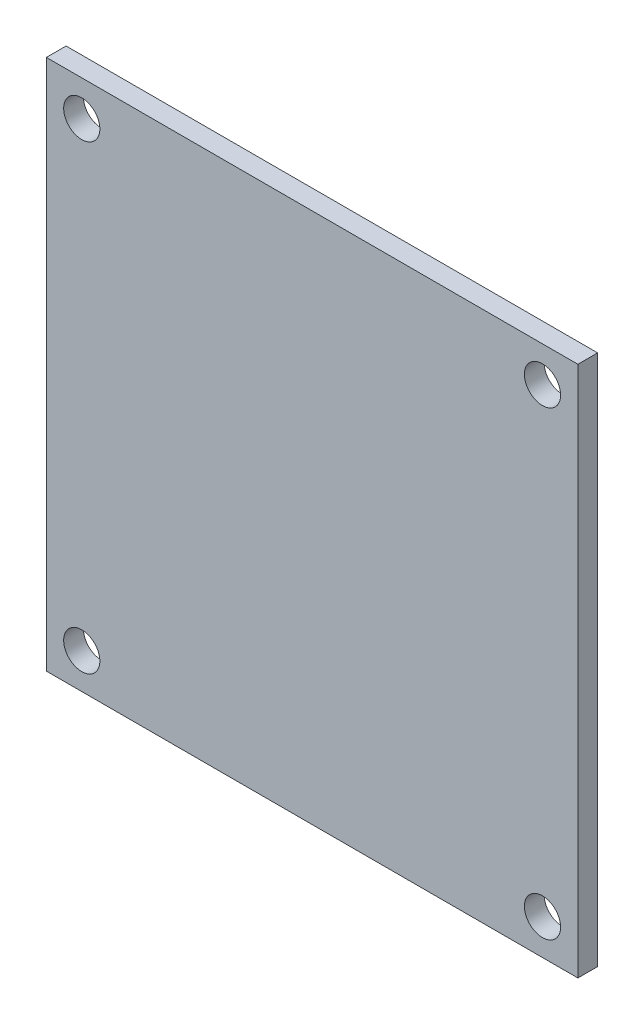
ISO-10303-21;
HEADER;
FILE_DESCRIPTION(('STEP AP214'),'2;1');
FILE_NAME('part.step','',(''),(''),'','','');
FILE_SCHEMA(('AUTOMOTIVE_DESIGN { 1 0 10303 214 1 1 1 1 }'));
ENDSEC;
DATA;
#1=APPLICATION_CONTEXT('core data for automotive mechanical design processes');
#2=APPLICATION_PROTOCOL_DEFINITION('international standard','automotive_design',2000,#1);
#3=PRODUCT_CONTEXT('',#1,'mechanical');
#4=PRODUCT('Part','Part','',(#3));
#5=PRODUCT_RELATED_PRODUCT_CATEGORY('part','',(#4));
#6=PRODUCT_DEFINITION_FORMATION('','',#4);
#7=PRODUCT_DEFINITION_CONTEXT('part definition',#1,'design');
#8=PRODUCT_DEFINITION('design','',#6,#7);
#9=PRODUCT_DEFINITION_SHAPE('','',#8);
#10=(LENGTH_UNIT() NAMED_UNIT(*) SI_UNIT(.MILLI.,.METRE.));
#11=(NAMED_UNIT(*) PLANE_ANGLE_UNIT() SI_UNIT($,.RADIAN.));
#12=(NAMED_UNIT(*) SI_UNIT($,.STERADIAN.) SOLID_ANGLE_UNIT());
#13=UNCERTAINTY_MEASURE_WITH_UNIT(LENGTH_MEASURE(1.E-05),#10,'distance_accuracy_value','');
#14=(GEOMETRIC_REPRESENTATION_CONTEXT(3) GLOBAL_UNCERTAINTY_ASSIGNED_CONTEXT((#13)) GLOBAL_UNIT_ASSIGNED_CONTEXT((#10,
#11,#12)) REPRESENTATION_CONTEXT('',''));
#15=CARTESIAN_POINT('',(0.,0.,0.));
#16=DIRECTION('',(0.,0.,1.));
#17=DIRECTION('',(1.,0.,0.));
#18=AXIS2_PLACEMENT_3D('',#15,#16,#17);
#19=CARTESIAN_POINT('',(16.15,-16.15,18.));
#20=DIRECTION('',(-1.,0.,0.));
#21=DIRECTION('',(0.,0.,1.));
#22=AXIS2_PLACEMENT_3D('',#19,#20,#21);
#23=PLANE('',#22);
#24=DIRECTION('',(0.,1.,0.));
#25=VECTOR('',#24,1.);
#26=CARTESIAN_POINT('',(16.15,-16.15,16.8));
#27=LINE('',#26,#25);
#28=CARTESIAN_POINT('',(16.15,-16.15,16.8));
#29=VERTEX_POINT('',#28);
#30=CARTESIAN_POINT('',(16.15,16.15,16.8));
#31=VERTEX_POINT('',#30);
#32=EDGE_CURVE('E98',#29,#31,#27,.T.);
#33=ORIENTED_EDGE('',*,*,#32,.T.);
#34=DIRECTION('',(0.,0.,-1.));
#35=VECTOR('',#34,1.);
#36=CARTESIAN_POINT('',(16.15,16.15,18.));
#37=LINE('',#36,#35);
#38=CARTESIAN_POINT('',(16.15,16.15,18.));
#39=VERTEX_POINT('',#38);
#40=EDGE_CURVE('E11',#39,#31,#37,.T.);
#41=ORIENTED_EDGE('',*,*,#40,.F.);
#42=DIRECTION('',(0.,1.,0.));
#43=VECTOR('',#42,1.);
#44=CARTESIAN_POINT('',(16.15,-16.15,18.));
#45=LINE('',#44,#43);
#46=CARTESIAN_POINT('',(16.15,-16.15,18.));
#47=VERTEX_POINT('',#46);
#48=EDGE_CURVE('E86',#47,#39,#45,.T.);
#49=ORIENTED_EDGE('',*,*,#48,.F.);
#50=DIRECTION('',(0.,0.,-1.));
#51=VECTOR('',#50,1.);
#52=CARTESIAN_POINT('',(16.15,-16.15,18.));
#53=LINE('',#52,#51);
#54=EDGE_CURVE('E94',#47,#29,#53,.T.);
#55=ORIENTED_EDGE('',*,*,#54,.T.);
#56=EDGE_LOOP('',(#33,#41,#49,#55));
#57=FACE_BOUND('',#56,.T.);
#58=ADVANCED_FACE('F35',(#57),#23,.F.);
#59=CARTESIAN_POINT('',(-16.15,16.15,18.));
#60=DIRECTION('',(0.,-1.,0.));
#61=DIRECTION('',(0.,0.,-1.));
#62=AXIS2_PLACEMENT_3D('',#59,#60,#61);
#63=PLANE('',#62);
#64=DIRECTION('',(-1.,0.,0.));
#65=VECTOR('',#64,1.);
#66=CARTESIAN_POINT('',(-16.15,16.15,16.8));
#67=LINE('',#66,#65);
#68=CARTESIAN_POINT('',(-16.15,16.15,16.8));
#69=VERTEX_POINT('',#68);
#70=EDGE_CURVE('E90',#31,#69,#67,.T.);
#71=ORIENTED_EDGE('',*,*,#70,.T.);
#72=DIRECTION('',(0.,0.,-1.));
#73=VECTOR('',#72,1.);
#74=CARTESIAN_POINT('',(-16.15,16.15,18.));
#75=LINE('',#74,#73);
#76=CARTESIAN_POINT('',(-16.15,16.15,18.));
#77=VERTEX_POINT('',#76);
#78=EDGE_CURVE('E43',#77,#69,#75,.T.);
#79=ORIENTED_EDGE('',*,*,#78,.F.);
#80=DIRECTION('',(-1.,0.,0.));
#81=VECTOR('',#80,1.);
#82=CARTESIAN_POINT('',(-16.15,16.15,18.));
#83=LINE('',#82,#81);
#84=EDGE_CURVE('E81',#39,#77,#83,.T.);
#85=ORIENTED_EDGE('',*,*,#84,.F.);
#86=ORIENTED_EDGE('',*,*,#40,.T.);
#87=EDGE_LOOP('',(#71,#79,#85,#86));
#88=FACE_BOUND('',#87,.T.);
#89=ADVANCED_FACE('F89',(#88),#63,.F.);
#90=CARTESIAN_POINT('',(-16.15,-16.15,18.));
#91=DIRECTION('',(1.,0.,0.));
#92=DIRECTION('',(0.,0.,-1.));
#93=AXIS2_PLACEMENT_3D('',#90,#91,#92);
#94=PLANE('',#93);
#95=DIRECTION('',(0.,-1.,0.));
#96=VECTOR('',#95,1.);
#97=CARTESIAN_POINT('',(-16.15,-16.15,16.8));
#98=LINE('',#97,#96);
#99=CARTESIAN_POINT('',(-16.15,-16.15,16.8));
#100=VERTEX_POINT('',#99);
#101=EDGE_CURVE('E68',#69,#100,#98,.T.);
#102=ORIENTED_EDGE('',*,*,#101,.T.);
#103=DIRECTION('',(0.,0.,-1.));
#104=VECTOR('',#103,1.);
#105=CARTESIAN_POINT('',(-16.15,-16.15,18.));
#106=LINE('',#105,#104);
#107=CARTESIAN_POINT('',(-16.15,-16.15,18.));
#108=VERTEX_POINT('',#107);
#109=EDGE_CURVE('E91',#108,#100,#106,.T.);
#110=ORIENTED_EDGE('',*,*,#109,.F.);
#111=DIRECTION('',(0.,-1.,0.));
#112=VECTOR('',#111,1.);
#113=CARTESIAN_POINT('',(-16.15,-16.15,18.));
#114=LINE('',#113,#112);
#115=EDGE_CURVE('E84',#77,#108,#114,.T.);
#116=ORIENTED_EDGE('',*,*,#115,.F.);
#117=ORIENTED_EDGE('',*,*,#78,.T.);
#118=EDGE_LOOP('',(#102,#110,#116,#117));
#119=FACE_BOUND('',#118,.T.);
#120=ADVANCED_FACE('F92',(#119),#94,.F.);
#121=CARTESIAN_POINT('',(-16.15,-16.15,18.));
#122=DIRECTION('',(0.,1.,0.));
#123=DIRECTION('',(0.,0.,1.));
#124=AXIS2_PLACEMENT_3D('',#121,#122,#123);
#125=PLANE('',#124);
#126=DIRECTION('',(1.,0.,0.));
#127=VECTOR('',#126,1.);
#128=CARTESIAN_POINT('',(-16.15,-16.15,16.8));
#129=LINE('',#128,#127);
#130=EDGE_CURVE('E74',#100,#29,#129,.T.);
#131=ORIENTED_EDGE('',*,*,#130,.T.);
#132=ORIENTED_EDGE('',*,*,#54,.F.);
#133=DIRECTION('',(1.,0.,0.));
#134=VECTOR('',#133,1.);
#135=CARTESIAN_POINT('',(-16.15,-16.15,18.));
#136=LINE('',#135,#134);
#137=EDGE_CURVE('E51',#108,#47,#136,.T.);
#138=ORIENTED_EDGE('',*,*,#137,.F.);
#139=ORIENTED_EDGE('',*,*,#109,.T.);
#140=EDGE_LOOP('',(#131,#132,#138,#139));
#141=FACE_BOUND('',#140,.T.);
#142=ADVANCED_FACE('F106',(#141),#125,.F.);
#143=CARTESIAN_POINT('',(0.,0.,18.));
#144=DIRECTION('',(0.,0.,-1.));
#145=DIRECTION('',(-1.,0.,0.));
#146=AXIS2_PLACEMENT_3D('',#143,#144,#145);
#147=PLANE('',#146);
#148=CARTESIAN_POINT('',(-14.,14.,18.));
#149=DIRECTION('',(0.,0.,1.));
#150=DIRECTION('',(1.,0.,0.));
#151=AXIS2_PLACEMENT_3D('',#148,#149,#150);
#152=CIRCLE('',#151,1.1);
#153=CARTESIAN_POINT('',(-12.9,14.,18.));
#154=VERTEX_POINT('',#153);
#155=EDGE_CURVE('E115',#154,#154,#152,.T.);
#156=ORIENTED_EDGE('',*,*,#155,.F.);
#157=EDGE_LOOP('',(#156));
#158=FACE_BOUND('',#157,.T.);
#159=CARTESIAN_POINT('',(14.,-14.,18.));
#160=DIRECTION('',(0.,0.,1.));
#161=DIRECTION('',(1.,0.,0.));
#162=AXIS2_PLACEMENT_3D('',#159,#160,#161);
#163=CIRCLE('',#162,1.1);
#164=CARTESIAN_POINT('',(15.1,-14.,18.));
#165=VERTEX_POINT('',#164);
#166=EDGE_CURVE('E121',#165,#165,#163,.T.);
#167=ORIENTED_EDGE('',*,*,#166,.F.);
#168=EDGE_LOOP('',(#167));
#169=FACE_BOUND('',#168,.T.);
#170=CARTESIAN_POINT('',(14.,14.,18.));
#171=DIRECTION('',(0.,0.,1.));
#172=DIRECTION('',(1.,0.,0.));
#173=AXIS2_PLACEMENT_3D('',#170,#171,#172);
#174=CIRCLE('',#173,1.1);
#175=CARTESIAN_POINT('',(15.1,14.,18.));
#176=VERTEX_POINT('',#175);
#177=EDGE_CURVE('E122',#176,#176,#174,.T.);
#178=ORIENTED_EDGE('',*,*,#177,.F.);
#179=EDGE_LOOP('',(#178));
#180=FACE_BOUND('',#179,.T.);
#181=CARTESIAN_POINT('',(-14.,-14.,18.));
#182=DIRECTION('',(0.,0.,1.));
#183=DIRECTION('',(1.,0.,0.));
#184=AXIS2_PLACEMENT_3D('',#181,#182,#183);
#185=CIRCLE('',#184,1.1);
#186=CARTESIAN_POINT('',(-12.9,-14.,18.));
#187=VERTEX_POINT('',#186);
#188=EDGE_CURVE('E101',#187,#187,#185,.T.);
#189=ORIENTED_EDGE('',*,*,#188,.F.);
#190=EDGE_LOOP('',(#189));
#191=FACE_BOUND('',#190,.T.);
#192=ORIENTED_EDGE('',*,*,#48,.T.);
#193=ORIENTED_EDGE('',*,*,#84,.T.);
#194=ORIENTED_EDGE('',*,*,#115,.T.);
#195=ORIENTED_EDGE('',*,*,#137,.T.);
#196=EDGE_LOOP('',(#192,#193,#194,#195));
#197=FACE_BOUND('',#196,.T.);
#198=ADVANCED_FACE('F82',(#158,#169,#180,#191,#197),#147,.F.);
#199=CARTESIAN_POINT('',(0.,0.,16.8));
#200=DIRECTION('',(0.,0.,-1.));
#201=DIRECTION('',(-1.,0.,0.));
#202=AXIS2_PLACEMENT_3D('',#199,#200,#201);
#203=PLANE('',#202);
#204=CARTESIAN_POINT('',(-14.,14.,16.8));
#205=DIRECTION('',(0.,0.,1.));
#206=DIRECTION('',(1.,0.,0.));
#207=AXIS2_PLACEMENT_3D('',#204,#205,#206);
#208=CIRCLE('',#207,1.1);
#209=CARTESIAN_POINT('',(-12.9,14.,16.8));
#210=VERTEX_POINT('',#209);
#211=EDGE_CURVE('E125',#210,#210,#208,.T.);
#212=ORIENTED_EDGE('',*,*,#211,.T.);
#213=EDGE_LOOP('',(#212));
#214=FACE_BOUND('',#213,.T.);
#215=CARTESIAN_POINT('',(14.,-14.,16.8));
#216=DIRECTION('',(0.,0.,1.));
#217=DIRECTION('',(1.,0.,0.));
#218=AXIS2_PLACEMENT_3D('',#215,#216,#217);
#219=CIRCLE('',#218,1.1);
#220=CARTESIAN_POINT('',(15.1,-14.,16.8));
#221=VERTEX_POINT('',#220);
#222=EDGE_CURVE('E118',#221,#221,#219,.T.);
#223=ORIENTED_EDGE('',*,*,#222,.T.);
#224=EDGE_LOOP('',(#223));
#225=FACE_BOUND('',#224,.T.);
#226=CARTESIAN_POINT('',(14.,14.,16.8));
#227=DIRECTION('',(0.,0.,1.));
#228=DIRECTION('',(1.,0.,0.));
#229=AXIS2_PLACEMENT_3D('',#226,#227,#228);
#230=CIRCLE('',#229,1.1);
#231=CARTESIAN_POINT('',(15.1,14.,16.8));
#232=VERTEX_POINT('',#231);
#233=EDGE_CURVE('E130',#232,#232,#230,.T.);
#234=ORIENTED_EDGE('',*,*,#233,.T.);
#235=EDGE_LOOP('',(#234));
#236=FACE_BOUND('',#235,.T.);
#237=CARTESIAN_POINT('',(-14.,-14.,16.8));
#238=DIRECTION('',(0.,0.,1.));
#239=DIRECTION('',(1.,0.,0.));
#240=AXIS2_PLACEMENT_3D('',#237,#238,#239);
#241=CIRCLE('',#240,1.1);
#242=CARTESIAN_POINT('',(-12.9,-14.,16.8));
#243=VERTEX_POINT('',#242);
#244=EDGE_CURVE('E112',#243,#243,#241,.T.);
#245=ORIENTED_EDGE('',*,*,#244,.T.);
#246=EDGE_LOOP('',(#245));
#247=FACE_BOUND('',#246,.T.);
#248=ORIENTED_EDGE('',*,*,#32,.F.);
#249=ORIENTED_EDGE('',*,*,#130,.F.);
#250=ORIENTED_EDGE('',*,*,#101,.F.);
#251=ORIENTED_EDGE('',*,*,#70,.F.);
#252=EDGE_LOOP('',(#248,#249,#250,#251));
#253=FACE_BOUND('',#252,.T.);
#254=ADVANCED_FACE('F109',(#214,#225,#236,#247,#253),#203,.T.);
#255=CARTESIAN_POINT('',(-14.,-14.,18.));
#256=DIRECTION('',(0.,0.,-1.));
#257=DIRECTION('',(-1.,0.,0.));
#258=AXIS2_PLACEMENT_3D('',#255,#256,#257);
#259=CYLINDRICAL_SURFACE('',#258,1.1);
#260=ORIENTED_EDGE('',*,*,#188,.T.);
#261=EDGE_LOOP('',(#260));
#262=FACE_BOUND('',#261,.T.);
#263=ORIENTED_EDGE('',*,*,#244,.F.);
#264=EDGE_LOOP('',(#263));
#265=FACE_BOUND('',#264,.T.);
#266=ADVANCED_FACE('F145',(#262,#265),#259,.F.);
#267=CARTESIAN_POINT('',(14.,14.,18.));
#268=DIRECTION('',(0.,0.,-1.));
#269=DIRECTION('',(-1.,0.,0.));
#270=AXIS2_PLACEMENT_3D('',#267,#268,#269);
#271=CYLINDRICAL_SURFACE('',#270,1.1);
#272=ORIENTED_EDGE('',*,*,#177,.T.);
#273=EDGE_LOOP('',(#272));
#274=FACE_BOUND('',#273,.T.);
#275=ORIENTED_EDGE('',*,*,#233,.F.);
#276=EDGE_LOOP('',(#275));
#277=FACE_BOUND('',#276,.T.);
#278=ADVANCED_FACE('F136',(#274,#277),#271,.F.);
#279=CARTESIAN_POINT('',(14.,-14.,18.));
#280=DIRECTION('',(0.,0.,-1.));
#281=DIRECTION('',(-1.,0.,0.));
#282=AXIS2_PLACEMENT_3D('',#279,#280,#281);
#283=CYLINDRICAL_SURFACE('',#282,1.1);
#284=ORIENTED_EDGE('',*,*,#166,.T.);
#285=EDGE_LOOP('',(#284));
#286=FACE_BOUND('',#285,.T.);
#287=ORIENTED_EDGE('',*,*,#222,.F.);
#288=EDGE_LOOP('',(#287));
#289=FACE_BOUND('',#288,.T.);
#290=ADVANCED_FACE('F194',(#286,#289),#283,.F.);
#291=CARTESIAN_POINT('',(-14.,14.,18.));
#292=DIRECTION('',(0.,0.,-1.));
#293=DIRECTION('',(-1.,0.,0.));
#294=AXIS2_PLACEMENT_3D('',#291,#292,#293);
#295=CYLINDRICAL_SURFACE('',#294,1.1);
#296=ORIENTED_EDGE('',*,*,#155,.T.);
#297=EDGE_LOOP('',(#296));
#298=FACE_BOUND('',#297,.T.);
#299=ORIENTED_EDGE('',*,*,#211,.F.);
#300=EDGE_LOOP('',(#299));
#301=FACE_BOUND('',#300,.T.);
#302=ADVANCED_FACE('F203',(#298,#301),#295,.F.);
#303=CLOSED_SHELL('',(#58,#89,#120,#142,#198,#254,#266,#278,#290,#302));
#304=MANIFOLD_SOLID_BREP('B2',#303);
#305=ADVANCED_BREP_SHAPE_REPRESENTATION('',(#18,#304),#14);
#306=SHAPE_DEFINITION_REPRESENTATION(#9,#305);
ENDSEC;
END-ISO-10303-21;
